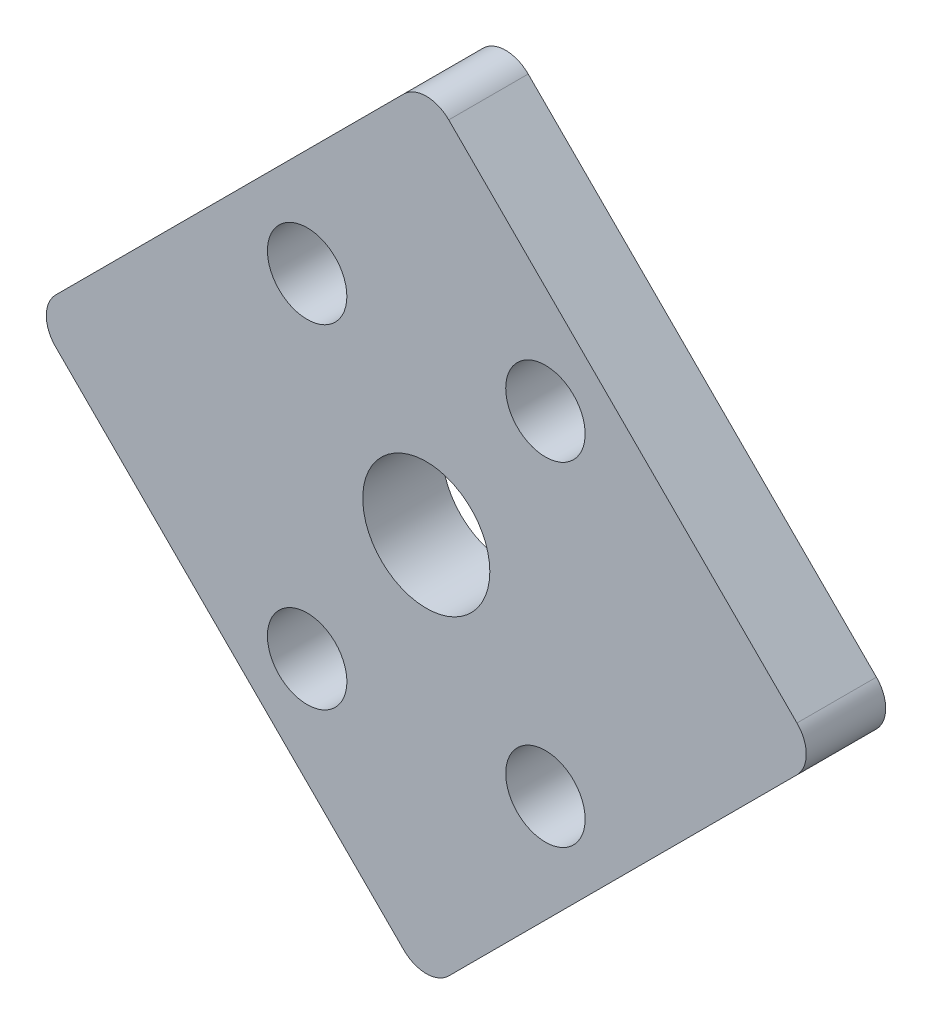
ISO-10303-21;
HEADER;
FILE_DESCRIPTION(('STEP AP214'),'2;1');
FILE_NAME('part.step','',(''),(''),'','','');
FILE_SCHEMA(('AUTOMOTIVE_DESIGN { 1 0 10303 214 1 1 1 1 }'));
ENDSEC;
DATA;
#1=APPLICATION_CONTEXT('core data for automotive mechanical design processes');
#2=APPLICATION_PROTOCOL_DEFINITION('international standard','automotive_design',2000,#1);
#3=PRODUCT_CONTEXT('',#1,'mechanical');
#4=PRODUCT('Part','Part','',(#3));
#5=PRODUCT_RELATED_PRODUCT_CATEGORY('part','',(#4));
#6=PRODUCT_DEFINITION_FORMATION('','',#4);
#7=PRODUCT_DEFINITION_CONTEXT('part definition',#1,'design');
#8=PRODUCT_DEFINITION('design','',#6,#7);
#9=PRODUCT_DEFINITION_SHAPE('','',#8);
#10=(LENGTH_UNIT() NAMED_UNIT(*) SI_UNIT(.MILLI.,.METRE.));
#11=(NAMED_UNIT(*) PLANE_ANGLE_UNIT() SI_UNIT($,.RADIAN.));
#12=(NAMED_UNIT(*) SI_UNIT($,.STERADIAN.) SOLID_ANGLE_UNIT());
#13=UNCERTAINTY_MEASURE_WITH_UNIT(LENGTH_MEASURE(1.E-05),#10,'distance_accuracy_value','');
#14=(GEOMETRIC_REPRESENTATION_CONTEXT(3) GLOBAL_UNCERTAINTY_ASSIGNED_CONTEXT((#13)) GLOBAL_UNIT_ASSIGNED_CONTEXT((#10,
#11,#12)) REPRESENTATION_CONTEXT('',''));
#15=CARTESIAN_POINT('',(0.,0.,0.));
#16=DIRECTION('',(0.,0.,1.));
#17=DIRECTION('',(1.,0.,0.));
#18=AXIS2_PLACEMENT_3D('',#15,#16,#17);
#19=CARTESIAN_POINT('',(-24.7487373415292,0.,5.));
#20=DIRECTION('',(0.707106781186548,0.707106781186547,0.));
#21=DIRECTION('',(-0.707106781186547,0.707106781186548,0.));
#22=AXIS2_PLACEMENT_3D('',#19,#20,#21);
#23=PLANE('',#22);
#24=DIRECTION('',(0.707106781186547,-0.707106781186548,0.));
#25=VECTOR('',#24,1.);
#26=CARTESIAN_POINT('',(-24.7487373415292,0.,0.));
#27=LINE('',#26,#25);
#28=CARTESIAN_POINT('',(-23.3345237791561,-1.4142135623731,0.));
#29=VERTEX_POINT('',#28);
#30=CARTESIAN_POINT('',(-1.4142135623731,-23.3345237791561,0.));
#31=VERTEX_POINT('',#30);
#32=EDGE_CURVE('E164',#29,#31,#27,.T.);
#33=ORIENTED_EDGE('',*,*,#32,.T.);
#34=DIRECTION('',(0.,0.,-1.));
#35=VECTOR('',#34,1.);
#36=CARTESIAN_POINT('',(-1.4142135623731,-23.3345237791561,5.));
#37=LINE('',#36,#35);
#38=CARTESIAN_POINT('',(-1.4142135623731,-23.3345237791561,5.));
#39=VERTEX_POINT('',#38);
#40=EDGE_CURVE('E11',#31,#39,#37,.F.);
#41=ORIENTED_EDGE('',*,*,#40,.T.);
#42=DIRECTION('',(0.707106781186547,-0.707106781186548,0.));
#43=VECTOR('',#42,1.);
#44=CARTESIAN_POINT('',(-24.7487373415292,0.,5.));
#45=LINE('',#44,#43);
#46=CARTESIAN_POINT('',(-23.3345237791561,-1.4142135623731,5.));
#47=VERTEX_POINT('',#46);
#48=EDGE_CURVE('E135',#47,#39,#45,.T.);
#49=ORIENTED_EDGE('',*,*,#48,.F.);
#50=DIRECTION('',(0.,0.,-1.));
#51=VECTOR('',#50,1.);
#52=CARTESIAN_POINT('',(-23.3345237791561,-1.4142135623731,5.));
#53=LINE('',#52,#51);
#54=EDGE_CURVE('E47',#47,#29,#53,.T.);
#55=ORIENTED_EDGE('',*,*,#54,.T.);
#56=EDGE_LOOP('',(#33,#41,#49,#55));
#57=FACE_BOUND('',#56,.T.);
#58=ADVANCED_FACE('F41',(#57),#23,.F.);
#59=CARTESIAN_POINT('',(0.,-24.7487373415292,5.));
#60=DIRECTION('',(-0.707106781186547,0.707106781186548,0.));
#61=DIRECTION('',(-0.707106781186548,-0.707106781186547,0.));
#62=AXIS2_PLACEMENT_3D('',#59,#60,#61);
#63=PLANE('',#62);
#64=DIRECTION('',(0.707106781186548,0.707106781186547,0.));
#65=VECTOR('',#64,1.);
#66=CARTESIAN_POINT('',(0.,-24.7487373415292,0.));
#67=LINE('',#66,#65);
#68=CARTESIAN_POINT('',(1.41421356237309,-23.3345237791561,0.));
#69=VERTEX_POINT('',#68);
#70=CARTESIAN_POINT('',(23.3345237791561,-1.4142135623731,0.));
#71=VERTEX_POINT('',#70);
#72=EDGE_CURVE('E138',#69,#71,#67,.T.);
#73=ORIENTED_EDGE('',*,*,#72,.T.);
#74=DIRECTION('',(0.,0.,-1.));
#75=VECTOR('',#74,1.);
#76=CARTESIAN_POINT('',(23.3345237791561,-1.4142135623731,5.));
#77=LINE('',#76,#75);
#78=CARTESIAN_POINT('',(23.3345237791561,-1.4142135623731,5.));
#79=VERTEX_POINT('',#78);
#80=EDGE_CURVE('E57',#71,#79,#77,.F.);
#81=ORIENTED_EDGE('',*,*,#80,.T.);
#82=DIRECTION('',(0.707106781186548,0.707106781186547,0.));
#83=VECTOR('',#82,1.);
#84=CARTESIAN_POINT('',(0.,-24.7487373415292,5.));
#85=LINE('',#84,#83);
#86=CARTESIAN_POINT('',(1.41421356237309,-23.3345237791561,5.));
#87=VERTEX_POINT('',#86);
#88=EDGE_CURVE('E137',#87,#79,#85,.T.);
#89=ORIENTED_EDGE('',*,*,#88,.F.);
#90=DIRECTION('',(0.,0.,-1.));
#91=VECTOR('',#90,1.);
#92=CARTESIAN_POINT('',(1.41421356237309,-23.3345237791561,5.));
#93=LINE('',#92,#91);
#94=EDGE_CURVE('E160',#87,#69,#93,.T.);
#95=ORIENTED_EDGE('',*,*,#94,.T.);
#96=EDGE_LOOP('',(#73,#81,#89,#95));
#97=FACE_BOUND('',#96,.T.);
#98=ADVANCED_FACE('F221',(#97),#63,.F.);
#99=CARTESIAN_POINT('',(24.7487373415292,0.,5.));
#100=DIRECTION('',(-0.707106781186548,-0.707106781186548,0.));
#101=DIRECTION('',(0.707106781186548,-0.707106781186548,0.));
#102=AXIS2_PLACEMENT_3D('',#99,#100,#101);
#103=PLANE('',#102);
#104=DIRECTION('',(-0.707106781186548,0.707106781186548,0.));
#105=VECTOR('',#104,1.);
#106=CARTESIAN_POINT('',(24.7487373415292,0.,0.));
#107=LINE('',#106,#105);
#108=CARTESIAN_POINT('',(23.3345237791561,1.41421356237309,0.));
#109=VERTEX_POINT('',#108);
#110=CARTESIAN_POINT('',(1.41421356237309,23.3345237791561,0.));
#111=VERTEX_POINT('',#110);
#112=EDGE_CURVE('E131',#109,#111,#107,.T.);
#113=ORIENTED_EDGE('',*,*,#112,.T.);
#114=DIRECTION('',(0.,0.,-1.));
#115=VECTOR('',#114,1.);
#116=CARTESIAN_POINT('',(1.4142135623731,23.3345237791561,5.));
#117=LINE('',#116,#115);
#118=CARTESIAN_POINT('',(1.41421356237309,23.3345237791561,5.));
#119=VERTEX_POINT('',#118);
#120=EDGE_CURVE('E115',#111,#119,#117,.F.);
#121=ORIENTED_EDGE('',*,*,#120,.T.);
#122=DIRECTION('',(-0.707106781186548,0.707106781186548,0.));
#123=VECTOR('',#122,1.);
#124=CARTESIAN_POINT('',(24.7487373415292,0.,5.));
#125=LINE('',#124,#123);
#126=CARTESIAN_POINT('',(23.3345237791561,1.41421356237309,5.));
#127=VERTEX_POINT('',#126);
#128=EDGE_CURVE('E180',#127,#119,#125,.T.);
#129=ORIENTED_EDGE('',*,*,#128,.F.);
#130=DIRECTION('',(0.,0.,-1.));
#131=VECTOR('',#130,1.);
#132=CARTESIAN_POINT('',(23.3345237791561,1.41421356237309,5.));
#133=LINE('',#132,#131);
#134=EDGE_CURVE('E120',#127,#109,#133,.T.);
#135=ORIENTED_EDGE('',*,*,#134,.T.);
#136=EDGE_LOOP('',(#113,#121,#129,#135));
#137=FACE_BOUND('',#136,.T.);
#138=ADVANCED_FACE('F225',(#137),#103,.F.);
#139=CARTESIAN_POINT('',(0.,24.7487373415292,5.));
#140=DIRECTION('',(0.707106781186548,-0.707106781186547,0.));
#141=DIRECTION('',(0.707106781186547,0.707106781186548,0.));
#142=AXIS2_PLACEMENT_3D('',#139,#140,#141);
#143=PLANE('',#142);
#144=DIRECTION('',(-0.707106781186547,-0.707106781186548,0.));
#145=VECTOR('',#144,1.);
#146=CARTESIAN_POINT('',(0.,24.7487373415292,5.));
#147=LINE('',#146,#145);
#148=CARTESIAN_POINT('',(-1.4142135623731,23.3345237791561,5.));
#149=VERTEX_POINT('',#148);
#150=CARTESIAN_POINT('',(-23.3345237791561,1.41421356237309,5.));
#151=VERTEX_POINT('',#150);
#152=EDGE_CURVE('E130',#149,#151,#147,.T.);
#153=ORIENTED_EDGE('',*,*,#152,.F.);
#154=DIRECTION('',(0.,0.,-1.));
#155=VECTOR('',#154,1.);
#156=CARTESIAN_POINT('',(-1.4142135623731,23.3345237791561,5.));
#157=LINE('',#156,#155);
#158=CARTESIAN_POINT('',(-1.4142135623731,23.3345237791561,0.));
#159=VERTEX_POINT('',#158);
#160=EDGE_CURVE('E111',#149,#159,#157,.T.);
#161=ORIENTED_EDGE('',*,*,#160,.T.);
#162=DIRECTION('',(-0.707106781186547,-0.707106781186548,0.));
#163=VECTOR('',#162,1.);
#164=CARTESIAN_POINT('',(0.,24.7487373415292,0.));
#165=LINE('',#164,#163);
#166=CARTESIAN_POINT('',(-23.3345237791561,1.41421356237309,0.));
#167=VERTEX_POINT('',#166);
#168=EDGE_CURVE('E121',#159,#167,#165,.T.);
#169=ORIENTED_EDGE('',*,*,#168,.T.);
#170=DIRECTION('',(0.,0.,-1.));
#171=VECTOR('',#170,1.);
#172=CARTESIAN_POINT('',(-23.3345237791561,1.41421356237309,5.));
#173=LINE('',#172,#171);
#174=EDGE_CURVE('E126',#167,#151,#173,.F.);
#175=ORIENTED_EDGE('',*,*,#174,.T.);
#176=EDGE_LOOP('',(#153,#161,#169,#175));
#177=FACE_BOUND('',#176,.T.);
#178=ADVANCED_FACE('F124',(#177),#143,.F.);
#179=CARTESIAN_POINT('',(0.,0.,5.));
#180=DIRECTION('',(0.,0.,1.));
#181=DIRECTION('',(1.,0.,0.));
#182=AXIS2_PLACEMENT_3D('',#179,#180,#181);
#183=PLANE('',#182);
#184=CARTESIAN_POINT('',(7.5,-10.5,5.));
#185=DIRECTION('',(0.,0.,1.));
#186=DIRECTION('',(1.,0.,0.));
#187=AXIS2_PLACEMENT_3D('',#184,#185,#186);
#188=CIRCLE('',#187,2.50000000000003);
#189=CARTESIAN_POINT('',(10.,-10.5,5.));
#190=VERTEX_POINT('',#189);
#191=EDGE_CURVE('E190',#190,#190,#188,.T.);
#192=ORIENTED_EDGE('',*,*,#191,.F.);
#193=EDGE_LOOP('',(#192));
#194=FACE_BOUND('',#193,.T.);
#195=CARTESIAN_POINT('',(-7.5,10.5,5.));
#196=DIRECTION('',(0.,0.,1.));
#197=DIRECTION('',(1.,0.,0.));
#198=AXIS2_PLACEMENT_3D('',#195,#196,#197);
#199=CIRCLE('',#198,2.50000000000003);
#200=CARTESIAN_POINT('',(-4.99999999999997,10.5,5.));
#201=VERTEX_POINT('',#200);
#202=EDGE_CURVE('E194',#201,#201,#199,.T.);
#203=ORIENTED_EDGE('',*,*,#202,.F.);
#204=EDGE_LOOP('',(#203));
#205=FACE_BOUND('',#204,.T.);
#206=CARTESIAN_POINT('',(-7.5,-10.5,5.));
#207=DIRECTION('',(0.,0.,1.));
#208=DIRECTION('',(-1.,0.,0.));
#209=AXIS2_PLACEMENT_3D('',#206,#207,#208);
#210=CIRCLE('',#209,2.50000000000003);
#211=CARTESIAN_POINT('',(-10.,-10.5,5.));
#212=VERTEX_POINT('',#211);
#213=EDGE_CURVE('E191',#212,#212,#210,.T.);
#214=ORIENTED_EDGE('',*,*,#213,.F.);
#215=EDGE_LOOP('',(#214));
#216=FACE_BOUND('',#215,.T.);
#217=CARTESIAN_POINT('',(7.5,10.5,5.));
#218=DIRECTION('',(0.,0.,1.));
#219=DIRECTION('',(-1.,0.,0.));
#220=AXIS2_PLACEMENT_3D('',#217,#218,#219);
#221=CIRCLE('',#220,2.50000000000003);
#222=CARTESIAN_POINT('',(4.99999999999997,10.5,5.));
#223=VERTEX_POINT('',#222);
#224=EDGE_CURVE('E183',#223,#223,#221,.T.);
#225=ORIENTED_EDGE('',*,*,#224,.F.);
#226=EDGE_LOOP('',(#225));
#227=FACE_BOUND('',#226,.T.);
#228=CARTESIAN_POINT('',(0.,0.,5.));
#229=DIRECTION('',(0.,0.,1.));
#230=DIRECTION('',(1.,0.,0.));
#231=AXIS2_PLACEMENT_3D('',#228,#229,#230);
#232=CIRCLE('',#231,4.);
#233=CARTESIAN_POINT('',(4.,0.,5.));
#234=VERTEX_POINT('',#233);
#235=EDGE_CURVE('E173',#234,#234,#232,.T.);
#236=ORIENTED_EDGE('',*,*,#235,.F.);
#237=EDGE_LOOP('',(#236));
#238=FACE_BOUND('',#237,.T.);
#239=ORIENTED_EDGE('',*,*,#128,.T.);
#240=CARTESIAN_POINT('',(0.,21.920310216783,5.));
#241=DIRECTION('',(0.,0.,1.));
#242=DIRECTION('',(1.,0.,0.));
#243=AXIS2_PLACEMENT_3D('',#240,#241,#242);
#244=CIRCLE('',#243,2.);
#245=EDGE_CURVE('E153',#119,#149,#244,.T.);
#246=ORIENTED_EDGE('',*,*,#245,.T.);
#247=ORIENTED_EDGE('',*,*,#152,.T.);
#248=CARTESIAN_POINT('',(-21.920310216783,0.,5.));
#249=DIRECTION('',(0.,0.,1.));
#250=DIRECTION('',(1.,0.,0.));
#251=AXIS2_PLACEMENT_3D('',#248,#249,#250);
#252=CIRCLE('',#251,2.);
#253=EDGE_CURVE('E148',#151,#47,#252,.T.);
#254=ORIENTED_EDGE('',*,*,#253,.T.);
#255=ORIENTED_EDGE('',*,*,#48,.T.);
#256=CARTESIAN_POINT('',(0.,-21.920310216783,5.));
#257=DIRECTION('',(0.,0.,1.));
#258=DIRECTION('',(1.,0.,0.));
#259=AXIS2_PLACEMENT_3D('',#256,#257,#258);
#260=CIRCLE('',#259,2.);
#261=EDGE_CURVE('E64',#39,#87,#260,.T.);
#262=ORIENTED_EDGE('',*,*,#261,.T.);
#263=ORIENTED_EDGE('',*,*,#88,.T.);
#264=CARTESIAN_POINT('',(21.920310216783,0.,5.));
#265=DIRECTION('',(0.,0.,1.));
#266=DIRECTION('',(1.,0.,0.));
#267=AXIS2_PLACEMENT_3D('',#264,#265,#266);
#268=CIRCLE('',#267,2.);
#269=EDGE_CURVE('E155',#79,#127,#268,.T.);
#270=ORIENTED_EDGE('',*,*,#269,.T.);
#271=EDGE_LOOP('',(#239,#246,#247,#254,#255,#262,#263,#270));
#272=FACE_BOUND('',#271,.T.);
#273=ADVANCED_FACE('F208',(#194,#205,#216,#227,#238,#272),#183,.T.);
#274=CARTESIAN_POINT('',(0.,0.,0.));
#275=DIRECTION('',(0.,0.,1.));
#276=DIRECTION('',(1.,0.,0.));
#277=AXIS2_PLACEMENT_3D('',#274,#275,#276);
#278=PLANE('',#277);
#279=CARTESIAN_POINT('',(7.5,-10.5,0.));
#280=DIRECTION('',(0.,0.,1.));
#281=DIRECTION('',(1.,0.,0.));
#282=AXIS2_PLACEMENT_3D('',#279,#280,#281);
#283=CIRCLE('',#282,2.50000000000003);
#284=CARTESIAN_POINT('',(10.,-10.5,0.));
#285=VERTEX_POINT('',#284);
#286=EDGE_CURVE('E199',#285,#285,#283,.T.);
#287=ORIENTED_EDGE('',*,*,#286,.T.);
#288=EDGE_LOOP('',(#287));
#289=FACE_BOUND('',#288,.T.);
#290=CARTESIAN_POINT('',(-7.5,10.5,0.));
#291=DIRECTION('',(0.,0.,1.));
#292=DIRECTION('',(1.,0.,0.));
#293=AXIS2_PLACEMENT_3D('',#290,#291,#292);
#294=CIRCLE('',#293,2.50000000000003);
#295=CARTESIAN_POINT('',(-4.99999999999997,10.5,0.));
#296=VERTEX_POINT('',#295);
#297=EDGE_CURVE('E188',#296,#296,#294,.T.);
#298=ORIENTED_EDGE('',*,*,#297,.T.);
#299=EDGE_LOOP('',(#298));
#300=FACE_BOUND('',#299,.T.);
#301=CARTESIAN_POINT('',(-7.5,-10.5,0.));
#302=DIRECTION('',(0.,0.,1.));
#303=DIRECTION('',(-1.,0.,0.));
#304=AXIS2_PLACEMENT_3D('',#301,#302,#303);
#305=CIRCLE('',#304,2.50000000000003);
#306=CARTESIAN_POINT('',(-10.,-10.5,0.));
#307=VERTEX_POINT('',#306);
#308=EDGE_CURVE('E205',#307,#307,#305,.T.);
#309=ORIENTED_EDGE('',*,*,#308,.T.);
#310=EDGE_LOOP('',(#309));
#311=FACE_BOUND('',#310,.T.);
#312=CARTESIAN_POINT('',(7.5,10.5,0.));
#313=DIRECTION('',(0.,0.,1.));
#314=DIRECTION('',(-1.,0.,0.));
#315=AXIS2_PLACEMENT_3D('',#312,#313,#314);
#316=CIRCLE('',#315,2.50000000000003);
#317=CARTESIAN_POINT('',(4.99999999999997,10.5,0.));
#318=VERTEX_POINT('',#317);
#319=EDGE_CURVE('E185',#318,#318,#316,.T.);
#320=ORIENTED_EDGE('',*,*,#319,.T.);
#321=EDGE_LOOP('',(#320));
#322=FACE_BOUND('',#321,.T.);
#323=CARTESIAN_POINT('',(0.,0.,0.));
#324=DIRECTION('',(0.,0.,1.));
#325=DIRECTION('',(1.,0.,0.));
#326=AXIS2_PLACEMENT_3D('',#323,#324,#325);
#327=CIRCLE('',#326,4.);
#328=CARTESIAN_POINT('',(4.,0.,0.));
#329=VERTEX_POINT('',#328);
#330=EDGE_CURVE('E167',#329,#329,#327,.T.);
#331=ORIENTED_EDGE('',*,*,#330,.T.);
#332=EDGE_LOOP('',(#331));
#333=FACE_BOUND('',#332,.T.);
#334=ORIENTED_EDGE('',*,*,#168,.F.);
#335=CARTESIAN_POINT('',(0.,21.920310216783,0.));
#336=DIRECTION('',(0.,0.,1.));
#337=DIRECTION('',(1.,0.,0.));
#338=AXIS2_PLACEMENT_3D('',#335,#336,#337);
#339=CIRCLE('',#338,2.);
#340=EDGE_CURVE('E110',#159,#111,#339,.F.);
#341=ORIENTED_EDGE('',*,*,#340,.T.);
#342=ORIENTED_EDGE('',*,*,#112,.F.);
#343=CARTESIAN_POINT('',(21.920310216783,0.,0.));
#344=DIRECTION('',(0.,0.,1.));
#345=DIRECTION('',(1.,0.,0.));
#346=AXIS2_PLACEMENT_3D('',#343,#344,#345);
#347=CIRCLE('',#346,2.);
#348=EDGE_CURVE('E117',#109,#71,#347,.F.);
#349=ORIENTED_EDGE('',*,*,#348,.T.);
#350=ORIENTED_EDGE('',*,*,#72,.F.);
#351=CARTESIAN_POINT('',(0.,-21.920310216783,0.));
#352=DIRECTION('',(0.,0.,1.));
#353=DIRECTION('',(1.,0.,0.));
#354=AXIS2_PLACEMENT_3D('',#351,#352,#353);
#355=CIRCLE('',#354,2.);
#356=EDGE_CURVE('E144',#69,#31,#355,.F.);
#357=ORIENTED_EDGE('',*,*,#356,.T.);
#358=ORIENTED_EDGE('',*,*,#32,.F.);
#359=CARTESIAN_POINT('',(-21.920310216783,0.,0.));
#360=DIRECTION('',(0.,0.,1.));
#361=DIRECTION('',(1.,0.,0.));
#362=AXIS2_PLACEMENT_3D('',#359,#360,#361);
#363=CIRCLE('',#362,2.);
#364=EDGE_CURVE('E129',#29,#167,#363,.F.);
#365=ORIENTED_EDGE('',*,*,#364,.T.);
#366=EDGE_LOOP('',(#334,#341,#342,#349,#350,#357,#358,#365));
#367=FACE_BOUND('',#366,.T.);
#368=ADVANCED_FACE('F132',(#289,#300,#311,#322,#333,#367),#278,.F.);
#369=CARTESIAN_POINT('',(0.,0.,0.));
#370=DIRECTION('',(0.,0.,1.));
#371=DIRECTION('',(1.,0.,0.));
#372=AXIS2_PLACEMENT_3D('',#369,#370,#371);
#373=CYLINDRICAL_SURFACE('',#372,4.);
#374=ORIENTED_EDGE('',*,*,#330,.F.);
#375=EDGE_LOOP('',(#374));
#376=FACE_BOUND('',#375,.T.);
#377=ORIENTED_EDGE('',*,*,#235,.T.);
#378=EDGE_LOOP('',(#377));
#379=FACE_BOUND('',#378,.T.);
#380=ADVANCED_FACE('F299',(#376,#379),#373,.F.);
#381=CARTESIAN_POINT('',(7.5,10.5,0.));
#382=DIRECTION('',(0.,0.,1.));
#383=DIRECTION('',(1.,0.,0.));
#384=AXIS2_PLACEMENT_3D('',#381,#382,#383);
#385=CYLINDRICAL_SURFACE('',#384,2.50000000000003);
#386=ORIENTED_EDGE('',*,*,#319,.F.);
#387=EDGE_LOOP('',(#386));
#388=FACE_BOUND('',#387,.T.);
#389=ORIENTED_EDGE('',*,*,#224,.T.);
#390=EDGE_LOOP('',(#389));
#391=FACE_BOUND('',#390,.T.);
#392=ADVANCED_FACE('F286',(#388,#391),#385,.F.);
#393=CARTESIAN_POINT('',(-7.5,-10.5,0.));
#394=DIRECTION('',(0.,0.,1.));
#395=DIRECTION('',(1.,0.,0.));
#396=AXIS2_PLACEMENT_3D('',#393,#394,#395);
#397=CYLINDRICAL_SURFACE('',#396,2.50000000000003);
#398=ORIENTED_EDGE('',*,*,#308,.F.);
#399=EDGE_LOOP('',(#398));
#400=FACE_BOUND('',#399,.T.);
#401=ORIENTED_EDGE('',*,*,#213,.T.);
#402=EDGE_LOOP('',(#401));
#403=FACE_BOUND('',#402,.T.);
#404=ADVANCED_FACE('F206',(#400,#403),#397,.F.);
#405=CARTESIAN_POINT('',(-7.5,10.5,0.));
#406=DIRECTION('',(0.,0.,1.));
#407=DIRECTION('',(1.,0.,0.));
#408=AXIS2_PLACEMENT_3D('',#405,#406,#407);
#409=CYLINDRICAL_SURFACE('',#408,2.50000000000003);
#410=ORIENTED_EDGE('',*,*,#297,.F.);
#411=EDGE_LOOP('',(#410));
#412=FACE_BOUND('',#411,.T.);
#413=ORIENTED_EDGE('',*,*,#202,.T.);
#414=EDGE_LOOP('',(#413));
#415=FACE_BOUND('',#414,.T.);
#416=ADVANCED_FACE('F271',(#412,#415),#409,.F.);
#417=CARTESIAN_POINT('',(7.5,-10.5,0.));
#418=DIRECTION('',(0.,0.,1.));
#419=DIRECTION('',(1.,0.,0.));
#420=AXIS2_PLACEMENT_3D('',#417,#418,#419);
#421=CYLINDRICAL_SURFACE('',#420,2.50000000000003);
#422=ORIENTED_EDGE('',*,*,#286,.F.);
#423=EDGE_LOOP('',(#422));
#424=FACE_BOUND('',#423,.T.);
#425=ORIENTED_EDGE('',*,*,#191,.T.);
#426=EDGE_LOOP('',(#425));
#427=FACE_BOUND('',#426,.T.);
#428=ADVANCED_FACE('F242',(#424,#427),#421,.F.);
#429=CARTESIAN_POINT('',(0.,21.920310216783,5.));
#430=DIRECTION('',(0.,0.,-1.));
#431=DIRECTION('',(-1.,0.,0.));
#432=AXIS2_PLACEMENT_3D('',#429,#430,#431);
#433=CYLINDRICAL_SURFACE('',#432,2.);
#434=ORIENTED_EDGE('',*,*,#245,.F.);
#435=ORIENTED_EDGE('',*,*,#120,.F.);
#436=ORIENTED_EDGE('',*,*,#340,.F.);
#437=ORIENTED_EDGE('',*,*,#160,.F.);
#438=EDGE_LOOP('',(#434,#435,#436,#437));
#439=FACE_BOUND('',#438,.T.);
#440=ADVANCED_FACE('F109',(#439),#433,.T.);
#441=CARTESIAN_POINT('',(21.920310216783,0.,5.));
#442=DIRECTION('',(0.,0.,-1.));
#443=DIRECTION('',(-1.,0.,0.));
#444=AXIS2_PLACEMENT_3D('',#441,#442,#443);
#445=CYLINDRICAL_SURFACE('',#444,2.);
#446=ORIENTED_EDGE('',*,*,#269,.F.);
#447=ORIENTED_EDGE('',*,*,#80,.F.);
#448=ORIENTED_EDGE('',*,*,#348,.F.);
#449=ORIENTED_EDGE('',*,*,#134,.F.);
#450=EDGE_LOOP('',(#446,#447,#448,#449));
#451=FACE_BOUND('',#450,.T.);
#452=ADVANCED_FACE('F224',(#451),#445,.T.);
#453=CARTESIAN_POINT('',(0.,-21.920310216783,5.));
#454=DIRECTION('',(0.,0.,-1.));
#455=DIRECTION('',(-1.,0.,0.));
#456=AXIS2_PLACEMENT_3D('',#453,#454,#455);
#457=CYLINDRICAL_SURFACE('',#456,2.);
#458=ORIENTED_EDGE('',*,*,#261,.F.);
#459=ORIENTED_EDGE('',*,*,#40,.F.);
#460=ORIENTED_EDGE('',*,*,#356,.F.);
#461=ORIENTED_EDGE('',*,*,#94,.F.);
#462=EDGE_LOOP('',(#458,#459,#460,#461));
#463=FACE_BOUND('',#462,.T.);
#464=ADVANCED_FACE('F226',(#463),#457,.T.);
#465=CARTESIAN_POINT('',(-21.920310216783,0.,5.));
#466=DIRECTION('',(0.,0.,-1.));
#467=DIRECTION('',(-1.,0.,0.));
#468=AXIS2_PLACEMENT_3D('',#465,#466,#467);
#469=CYLINDRICAL_SURFACE('',#468,2.);
#470=ORIENTED_EDGE('',*,*,#253,.F.);
#471=ORIENTED_EDGE('',*,*,#174,.F.);
#472=ORIENTED_EDGE('',*,*,#364,.F.);
#473=ORIENTED_EDGE('',*,*,#54,.F.);
#474=EDGE_LOOP('',(#470,#471,#472,#473));
#475=FACE_BOUND('',#474,.T.);
#476=ADVANCED_FACE('F43',(#475),#469,.T.);
#477=CLOSED_SHELL('',(#58,#98,#138,#178,#273,#368,#380,#392,#404,#416,#428,#440,#452,#464,#476));
#478=MANIFOLD_SOLID_BREP('B2',#477);
#479=ADVANCED_BREP_SHAPE_REPRESENTATION('',(#18,#478),#14);
#480=SHAPE_DEFINITION_REPRESENTATION(#9,#479);
ENDSEC;
END-ISO-10303-21;
